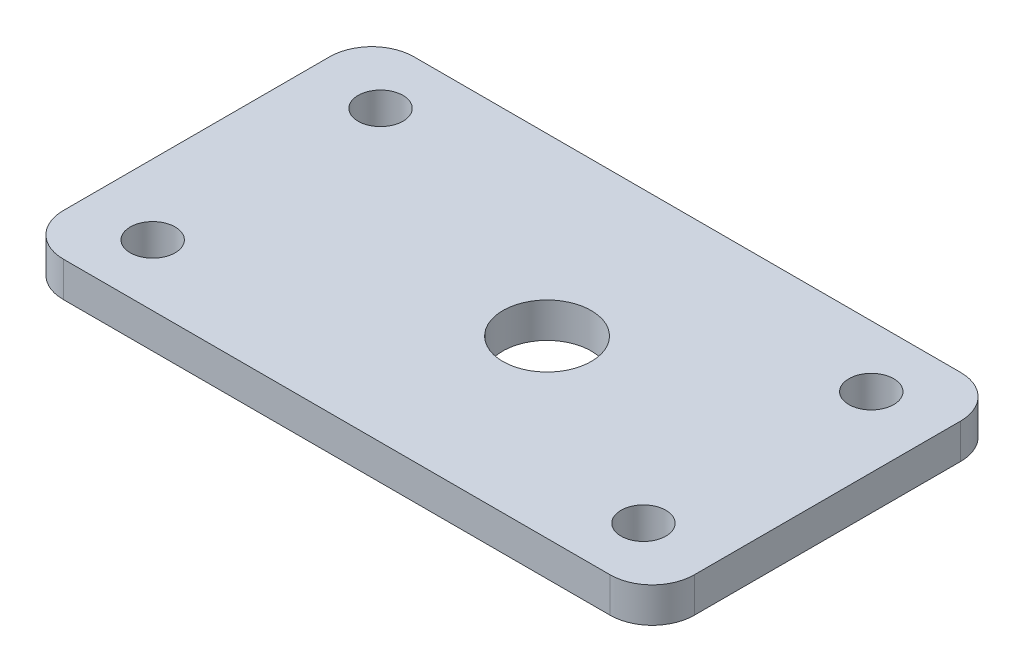
ISO-10303-21;
HEADER;
FILE_DESCRIPTION(('STEP AP214'),'2;1');
FILE_NAME('part.step','',(''),(''),'','','');
FILE_SCHEMA(('AUTOMOTIVE_DESIGN { 1 0 10303 214 1 1 1 1 }'));
ENDSEC;
DATA;
#1=APPLICATION_CONTEXT('core data for automotive mechanical design processes');
#2=APPLICATION_PROTOCOL_DEFINITION('international standard','automotive_design',2000,#1);
#3=PRODUCT_CONTEXT('',#1,'mechanical');
#4=PRODUCT('Part','Part','',(#3));
#5=PRODUCT_RELATED_PRODUCT_CATEGORY('part','',(#4));
#6=PRODUCT_DEFINITION_FORMATION('','',#4);
#7=PRODUCT_DEFINITION_CONTEXT('part definition',#1,'design');
#8=PRODUCT_DEFINITION('design','',#6,#7);
#9=PRODUCT_DEFINITION_SHAPE('','',#8);
#10=(LENGTH_UNIT() NAMED_UNIT(*) SI_UNIT(.MILLI.,.METRE.));
#11=(NAMED_UNIT(*) PLANE_ANGLE_UNIT() SI_UNIT($,.RADIAN.));
#12=(NAMED_UNIT(*) SI_UNIT($,.STERADIAN.) SOLID_ANGLE_UNIT());
#13=UNCERTAINTY_MEASURE_WITH_UNIT(LENGTH_MEASURE(1.E-05),#10,'distance_accuracy_value','');
#14=(GEOMETRIC_REPRESENTATION_CONTEXT(3) GLOBAL_UNCERTAINTY_ASSIGNED_CONTEXT((#13)) GLOBAL_UNIT_ASSIGNED_CONTEXT((#10,
#11,#12)) REPRESENTATION_CONTEXT('',''));
#15=CARTESIAN_POINT('',(0.,0.,0.));
#16=DIRECTION('',(0.,0.,1.));
#17=DIRECTION('',(1.,0.,0.));
#18=AXIS2_PLACEMENT_3D('',#15,#16,#17);
#19=CARTESIAN_POINT('',(0.,3.175,0.));
#20=DIRECTION('',(0.,1.,0.));
#21=DIRECTION('',(0.,0.,1.));
#22=AXIS2_PLACEMENT_3D('',#19,#20,#21);
#23=PLANE('',#22);
#24=CARTESIAN_POINT('',(22.2250000000296,3.175,10.3187500000224));
#25=DIRECTION('',(0.,-1.,0.));
#26=DIRECTION('',(0.,0.,-1.));
#27=AXIS2_PLACEMENT_3D('',#24,#25,#26);
#28=CIRCLE('',#27,2.03199999996506);
#29=CARTESIAN_POINT('',(22.2250000000296,3.175,8.28675000005738));
#30=VERTEX_POINT('',#29);
#31=EDGE_CURVE('E220',#30,#30,#28,.T.);
#32=ORIENTED_EDGE('',*,*,#31,.T.);
#33=EDGE_LOOP('',(#32));
#34=FACE_BOUND('',#33,.T.);
#35=CARTESIAN_POINT('',(-22.2249999999706,3.175,-10.3187499999772));
#36=DIRECTION('',(0.,-1.,0.));
#37=DIRECTION('',(0.,0.,-1.));
#38=AXIS2_PLACEMENT_3D('',#35,#36,#37);
#39=CIRCLE('',#38,2.03199999996518);
#40=CARTESIAN_POINT('',(-22.2249999999706,3.175,-12.3507499999424));
#41=VERTEX_POINT('',#40);
#42=EDGE_CURVE('E208',#41,#41,#39,.T.);
#43=ORIENTED_EDGE('',*,*,#42,.T.);
#44=EDGE_LOOP('',(#43));
#45=FACE_BOUND('',#44,.T.);
#46=CARTESIAN_POINT('',(-22.2249999999704,3.175,10.3187500000228));
#47=DIRECTION('',(0.,-1.,0.));
#48=DIRECTION('',(0.,0.,-1.));
#49=AXIS2_PLACEMENT_3D('',#46,#47,#48);
#50=CIRCLE('',#49,2.03199999996497);
#51=CARTESIAN_POINT('',(-22.2249999999704,3.175,8.28675000005783));
#52=VERTEX_POINT('',#51);
#53=EDGE_CURVE('E225',#52,#52,#50,.T.);
#54=ORIENTED_EDGE('',*,*,#53,.T.);
#55=EDGE_LOOP('',(#54));
#56=FACE_BOUND('',#55,.T.);
#57=CARTESIAN_POINT('',(22.2250000000294,3.175,-10.3187499999775));
#58=DIRECTION('',(0.,-1.,0.));
#59=DIRECTION('',(0.,0.,-1.));
#60=AXIS2_PLACEMENT_3D('',#57,#58,#59);
#61=CIRCLE('',#60,2.03199999996526);
#62=CARTESIAN_POINT('',(22.2250000000294,3.175,-12.3507499999428));
#63=VERTEX_POINT('',#62);
#64=EDGE_CURVE('E202',#63,#63,#61,.T.);
#65=ORIENTED_EDGE('',*,*,#64,.T.);
#66=EDGE_LOOP('',(#65));
#67=FACE_BOUND('',#66,.T.);
#68=DIRECTION('',(0.,0.,-1.));
#69=VECTOR('',#68,1.);
#70=CARTESIAN_POINT('',(28.575,3.175,15.875));
#71=LINE('',#70,#69);
#72=CARTESIAN_POINT('',(28.575,3.175,12.065));
#73=VERTEX_POINT('',#72);
#74=CARTESIAN_POINT('',(28.575,3.175,-12.065));
#75=VERTEX_POINT('',#74);
#76=EDGE_CURVE('E158',#73,#75,#71,.T.);
#77=ORIENTED_EDGE('',*,*,#76,.T.);
#78=CARTESIAN_POINT('',(24.765,3.175,-12.065));
#79=DIRECTION('',(0.,1.,0.));
#80=DIRECTION('',(0.,0.,1.));
#81=AXIS2_PLACEMENT_3D('',#78,#79,#80);
#82=CIRCLE('',#81,3.81);
#83=CARTESIAN_POINT('',(24.765,3.175,-15.875));
#84=VERTEX_POINT('',#83);
#85=EDGE_CURVE('E173',#75,#84,#82,.T.);
#86=ORIENTED_EDGE('',*,*,#85,.T.);
#87=DIRECTION('',(-1.,0.,0.));
#88=VECTOR('',#87,1.);
#89=CARTESIAN_POINT('',(28.575,3.175,-15.875));
#90=LINE('',#89,#88);
#91=CARTESIAN_POINT('',(-24.765,3.175,-15.875));
#92=VERTEX_POINT('',#91);
#93=EDGE_CURVE('E136',#84,#92,#90,.T.);
#94=ORIENTED_EDGE('',*,*,#93,.T.);
#95=CARTESIAN_POINT('',(-24.765,3.175,-12.065));
#96=DIRECTION('',(0.,1.,0.));
#97=DIRECTION('',(0.,0.,1.));
#98=AXIS2_PLACEMENT_3D('',#95,#96,#97);
#99=CIRCLE('',#98,3.81);
#100=CARTESIAN_POINT('',(-28.575,3.175,-12.065));
#101=VERTEX_POINT('',#100);
#102=EDGE_CURVE('E166',#92,#101,#99,.T.);
#103=ORIENTED_EDGE('',*,*,#102,.T.);
#104=DIRECTION('',(0.,0.,-1.));
#105=VECTOR('',#104,1.);
#106=CARTESIAN_POINT('',(-28.575,3.175,15.875));
#107=LINE('',#106,#105);
#108=CARTESIAN_POINT('',(-28.575,3.175,12.065));
#109=VERTEX_POINT('',#108);
#110=EDGE_CURVE('E184',#109,#101,#107,.T.);
#111=ORIENTED_EDGE('',*,*,#110,.F.);
#112=CARTESIAN_POINT('',(-24.765,3.175,12.065));
#113=DIRECTION('',(0.,1.,0.));
#114=DIRECTION('',(0.,0.,1.));
#115=AXIS2_PLACEMENT_3D('',#112,#113,#114);
#116=CIRCLE('',#115,3.81);
#117=CARTESIAN_POINT('',(-24.765,3.175,15.875));
#118=VERTEX_POINT('',#117);
#119=EDGE_CURVE('E69',#109,#118,#116,.T.);
#120=ORIENTED_EDGE('',*,*,#119,.T.);
#121=DIRECTION('',(-1.,0.,0.));
#122=VECTOR('',#121,1.);
#123=CARTESIAN_POINT('',(28.575,3.175,15.875));
#124=LINE('',#123,#122);
#125=CARTESIAN_POINT('',(24.765,3.175,15.875));
#126=VERTEX_POINT('',#125);
#127=EDGE_CURVE('E159',#126,#118,#124,.T.);
#128=ORIENTED_EDGE('',*,*,#127,.F.);
#129=CARTESIAN_POINT('',(24.765,3.175,12.065));
#130=DIRECTION('',(0.,1.,0.));
#131=DIRECTION('',(0.,0.,1.));
#132=AXIS2_PLACEMENT_3D('',#129,#130,#131);
#133=CIRCLE('',#132,3.81);
#134=EDGE_CURVE('E171',#126,#73,#133,.T.);
#135=ORIENTED_EDGE('',*,*,#134,.T.);
#136=EDGE_LOOP('',(#77,#86,#94,#103,#111,#120,#128,#135));
#137=FACE_BOUND('',#136,.T.);
#138=CARTESIAN_POINT('',(3.175,3.175,0.));
#139=DIRECTION('',(0.,1.,0.));
#140=DIRECTION('',(0.,0.,1.));
#141=AXIS2_PLACEMENT_3D('',#138,#139,#140);
#142=CIRCLE('',#141,4.);
#143=CARTESIAN_POINT('',(3.175,3.175,4.));
#144=VERTEX_POINT('',#143);
#145=EDGE_CURVE('E155',#144,#144,#142,.T.);
#146=ORIENTED_EDGE('',*,*,#145,.F.);
#147=EDGE_LOOP('',(#146));
#148=FACE_BOUND('',#147,.T.);
#149=ADVANCED_FACE('F53',(#34,#45,#56,#67,#137,#148),#23,.T.);
#150=CARTESIAN_POINT('',(0.,0.,0.));
#151=DIRECTION('',(0.,1.,0.));
#152=DIRECTION('',(0.,0.,1.));
#153=AXIS2_PLACEMENT_3D('',#150,#151,#152);
#154=PLANE('',#153);
#155=CARTESIAN_POINT('',(22.2250000000296,0.,10.3187500000224));
#156=DIRECTION('',(0.,-1.,0.));
#157=DIRECTION('',(0.,0.,-1.));
#158=AXIS2_PLACEMENT_3D('',#155,#156,#157);
#159=CIRCLE('',#158,2.03199999996506);
#160=CARTESIAN_POINT('',(22.2250000000296,0.,8.28675000005738));
#161=VERTEX_POINT('',#160);
#162=EDGE_CURVE('E210',#161,#161,#159,.T.);
#163=ORIENTED_EDGE('',*,*,#162,.F.);
#164=EDGE_LOOP('',(#163));
#165=FACE_BOUND('',#164,.T.);
#166=CARTESIAN_POINT('',(-22.2249999999706,0.,-10.3187499999772));
#167=DIRECTION('',(0.,-1.,0.));
#168=DIRECTION('',(0.,0.,-1.));
#169=AXIS2_PLACEMENT_3D('',#166,#167,#168);
#170=CIRCLE('',#169,2.03199999996518);
#171=CARTESIAN_POINT('',(-22.2249999999706,0.,-12.3507499999424));
#172=VERTEX_POINT('',#171);
#173=EDGE_CURVE('E214',#172,#172,#170,.T.);
#174=ORIENTED_EDGE('',*,*,#173,.F.);
#175=EDGE_LOOP('',(#174));
#176=FACE_BOUND('',#175,.T.);
#177=CARTESIAN_POINT('',(-22.2249999999704,0.,10.3187500000228));
#178=DIRECTION('',(0.,-1.,0.));
#179=DIRECTION('',(0.,0.,-1.));
#180=AXIS2_PLACEMENT_3D('',#177,#178,#179);
#181=CIRCLE('',#180,2.03199999996497);
#182=CARTESIAN_POINT('',(-22.2249999999704,0.,8.28675000005783));
#183=VERTEX_POINT('',#182);
#184=EDGE_CURVE('E211',#183,#183,#181,.T.);
#185=ORIENTED_EDGE('',*,*,#184,.F.);
#186=EDGE_LOOP('',(#185));
#187=FACE_BOUND('',#186,.T.);
#188=CARTESIAN_POINT('',(22.2250000000294,0.,-10.3187499999775));
#189=DIRECTION('',(0.,-1.,0.));
#190=DIRECTION('',(0.,0.,-1.));
#191=AXIS2_PLACEMENT_3D('',#188,#189,#190);
#192=CIRCLE('',#191,2.03199999996526);
#193=CARTESIAN_POINT('',(22.2250000000294,0.,-12.3507499999428));
#194=VERTEX_POINT('',#193);
#195=EDGE_CURVE('E204',#194,#194,#192,.T.);
#196=ORIENTED_EDGE('',*,*,#195,.F.);
#197=EDGE_LOOP('',(#196));
#198=FACE_BOUND('',#197,.T.);
#199=DIRECTION('',(-1.,0.,0.));
#200=VECTOR('',#199,1.);
#201=CARTESIAN_POINT('',(28.575,0.,-15.875));
#202=LINE('',#201,#200);
#203=CARTESIAN_POINT('',(24.765,0.,-15.875));
#204=VERTEX_POINT('',#203);
#205=CARTESIAN_POINT('',(-24.765,0.,-15.875));
#206=VERTEX_POINT('',#205);
#207=EDGE_CURVE('E140',#204,#206,#202,.T.);
#208=ORIENTED_EDGE('',*,*,#207,.F.);
#209=CARTESIAN_POINT('',(24.765,0.,-12.065));
#210=DIRECTION('',(0.,1.,0.));
#211=DIRECTION('',(0.,0.,1.));
#212=AXIS2_PLACEMENT_3D('',#209,#210,#211);
#213=CIRCLE('',#212,3.81);
#214=CARTESIAN_POINT('',(28.575,0.,-12.065));
#215=VERTEX_POINT('',#214);
#216=EDGE_CURVE('E119',#204,#215,#213,.F.);
#217=ORIENTED_EDGE('',*,*,#216,.T.);
#218=DIRECTION('',(0.,0.,-1.));
#219=VECTOR('',#218,1.);
#220=CARTESIAN_POINT('',(28.575,0.,15.875));
#221=LINE('',#220,#219);
#222=CARTESIAN_POINT('',(28.575,0.,12.065));
#223=VERTEX_POINT('',#222);
#224=EDGE_CURVE('E149',#223,#215,#221,.T.);
#225=ORIENTED_EDGE('',*,*,#224,.F.);
#226=CARTESIAN_POINT('',(24.765,0.,12.065));
#227=DIRECTION('',(0.,1.,0.));
#228=DIRECTION('',(0.,0.,1.));
#229=AXIS2_PLACEMENT_3D('',#226,#227,#228);
#230=CIRCLE('',#229,3.81);
#231=CARTESIAN_POINT('',(24.765,0.,15.875));
#232=VERTEX_POINT('',#231);
#233=EDGE_CURVE('E132',#223,#232,#230,.F.);
#234=ORIENTED_EDGE('',*,*,#233,.T.);
#235=DIRECTION('',(-1.,0.,0.));
#236=VECTOR('',#235,1.);
#237=CARTESIAN_POINT('',(28.575,0.,15.875));
#238=LINE('',#237,#236);
#239=CARTESIAN_POINT('',(-24.765,0.,15.875));
#240=VERTEX_POINT('',#239);
#241=EDGE_CURVE('E148',#232,#240,#238,.T.);
#242=ORIENTED_EDGE('',*,*,#241,.T.);
#243=CARTESIAN_POINT('',(-24.765,0.,12.065));
#244=DIRECTION('',(0.,1.,0.));
#245=DIRECTION('',(0.,0.,1.));
#246=AXIS2_PLACEMENT_3D('',#243,#244,#245);
#247=CIRCLE('',#246,3.81);
#248=CARTESIAN_POINT('',(-28.575,0.,12.065));
#249=VERTEX_POINT('',#248);
#250=EDGE_CURVE('E162',#240,#249,#247,.F.);
#251=ORIENTED_EDGE('',*,*,#250,.T.);
#252=DIRECTION('',(0.,0.,-1.));
#253=VECTOR('',#252,1.);
#254=CARTESIAN_POINT('',(-28.575,0.,15.875));
#255=LINE('',#254,#253);
#256=CARTESIAN_POINT('',(-28.575,0.,-12.065));
#257=VERTEX_POINT('',#256);
#258=EDGE_CURVE('E150',#249,#257,#255,.T.);
#259=ORIENTED_EDGE('',*,*,#258,.T.);
#260=CARTESIAN_POINT('',(-24.765,0.,-12.065));
#261=DIRECTION('',(0.,1.,0.));
#262=DIRECTION('',(0.,0.,1.));
#263=AXIS2_PLACEMENT_3D('',#260,#261,#262);
#264=CIRCLE('',#263,3.81);
#265=EDGE_CURVE('E142',#257,#206,#264,.F.);
#266=ORIENTED_EDGE('',*,*,#265,.T.);
#267=EDGE_LOOP('',(#208,#217,#225,#234,#242,#251,#259,#266));
#268=FACE_BOUND('',#267,.T.);
#269=CARTESIAN_POINT('',(3.175,0.,0.));
#270=DIRECTION('',(0.,1.,0.));
#271=DIRECTION('',(0.,0.,1.));
#272=AXIS2_PLACEMENT_3D('',#269,#270,#271);
#273=CIRCLE('',#272,4.);
#274=CARTESIAN_POINT('',(3.175,0.,4.));
#275=VERTEX_POINT('',#274);
#276=EDGE_CURVE('E198',#275,#275,#273,.T.);
#277=ORIENTED_EDGE('',*,*,#276,.T.);
#278=EDGE_LOOP('',(#277));
#279=FACE_BOUND('',#278,.T.);
#280=ADVANCED_FACE('F144',(#165,#176,#187,#198,#268,#279),#154,.F.);
#281=CARTESIAN_POINT('',(28.575,3.175,15.875));
#282=DIRECTION('',(-1.,0.,0.));
#283=DIRECTION('',(0.,0.,1.));
#284=AXIS2_PLACEMENT_3D('',#281,#282,#283);
#285=PLANE('',#284);
#286=ORIENTED_EDGE('',*,*,#224,.T.);
#287=DIRECTION('',(0.,-1.,0.));
#288=VECTOR('',#287,1.);
#289=CARTESIAN_POINT('',(28.575,3.175,-12.065));
#290=LINE('',#289,#288);
#291=EDGE_CURVE('E123',#215,#75,#290,.F.);
#292=ORIENTED_EDGE('',*,*,#291,.T.);
#293=ORIENTED_EDGE('',*,*,#76,.F.);
#294=DIRECTION('',(0.,-1.,0.));
#295=VECTOR('',#294,1.);
#296=CARTESIAN_POINT('',(28.575,0.,12.065));
#297=LINE('',#296,#295);
#298=EDGE_CURVE('E128',#73,#223,#297,.T.);
#299=ORIENTED_EDGE('',*,*,#298,.T.);
#300=EDGE_LOOP('',(#286,#292,#293,#299));
#301=FACE_BOUND('',#300,.T.);
#302=ADVANCED_FACE('F235',(#301),#285,.F.);
#303=CARTESIAN_POINT('',(28.575,3.175,-15.875));
#304=DIRECTION('',(0.,0.,1.));
#305=DIRECTION('',(1.,0.,0.));
#306=AXIS2_PLACEMENT_3D('',#303,#304,#305);
#307=PLANE('',#306);
#308=ORIENTED_EDGE('',*,*,#93,.F.);
#309=DIRECTION('',(0.,-1.,0.));
#310=VECTOR('',#309,1.);
#311=CARTESIAN_POINT('',(24.765,3.175,-15.875));
#312=LINE('',#311,#310);
#313=EDGE_CURVE('E121',#84,#204,#312,.T.);
#314=ORIENTED_EDGE('',*,*,#313,.T.);
#315=ORIENTED_EDGE('',*,*,#207,.T.);
#316=DIRECTION('',(0.,-1.,0.));
#317=VECTOR('',#316,1.);
#318=CARTESIAN_POINT('',(-24.765,3.175,-15.875));
#319=LINE('',#318,#317);
#320=EDGE_CURVE('E145',#206,#92,#319,.F.);
#321=ORIENTED_EDGE('',*,*,#320,.T.);
#322=EDGE_LOOP('',(#308,#314,#315,#321));
#323=FACE_BOUND('',#322,.T.);
#324=ADVANCED_FACE('F137',(#323),#307,.F.);
#325=CARTESIAN_POINT('',(-28.575,3.175,15.875));
#326=DIRECTION('',(-1.,0.,0.));
#327=DIRECTION('',(0.,0.,1.));
#328=AXIS2_PLACEMENT_3D('',#325,#326,#327);
#329=PLANE('',#328);
#330=ORIENTED_EDGE('',*,*,#258,.F.);
#331=DIRECTION('',(0.,-1.,0.));
#332=VECTOR('',#331,1.);
#333=CARTESIAN_POINT('',(-28.575,3.175,12.065));
#334=LINE('',#333,#332);
#335=EDGE_CURVE('E12',#249,#109,#334,.F.);
#336=ORIENTED_EDGE('',*,*,#335,.T.);
#337=ORIENTED_EDGE('',*,*,#110,.T.);
#338=DIRECTION('',(0.,-1.,0.));
#339=VECTOR('',#338,1.);
#340=CARTESIAN_POINT('',(-28.575,0.,-12.065));
#341=LINE('',#340,#339);
#342=EDGE_CURVE('E65',#101,#257,#341,.T.);
#343=ORIENTED_EDGE('',*,*,#342,.T.);
#344=EDGE_LOOP('',(#330,#336,#337,#343));
#345=FACE_BOUND('',#344,.T.);
#346=ADVANCED_FACE('F182',(#345),#329,.T.);
#347=CARTESIAN_POINT('',(28.575,3.175,15.875));
#348=DIRECTION('',(0.,0.,1.));
#349=DIRECTION('',(1.,0.,0.));
#350=AXIS2_PLACEMENT_3D('',#347,#348,#349);
#351=PLANE('',#350);
#352=ORIENTED_EDGE('',*,*,#241,.F.);
#353=DIRECTION('',(0.,-1.,0.));
#354=VECTOR('',#353,1.);
#355=CARTESIAN_POINT('',(24.765,3.175,15.875));
#356=LINE('',#355,#354);
#357=EDGE_CURVE('E77',#232,#126,#356,.F.);
#358=ORIENTED_EDGE('',*,*,#357,.T.);
#359=ORIENTED_EDGE('',*,*,#127,.T.);
#360=DIRECTION('',(0.,-1.,0.));
#361=VECTOR('',#360,1.);
#362=CARTESIAN_POINT('',(-24.765,3.175,15.875));
#363=LINE('',#362,#361);
#364=EDGE_CURVE('E174',#118,#240,#363,.T.);
#365=ORIENTED_EDGE('',*,*,#364,.T.);
#366=EDGE_LOOP('',(#352,#358,#359,#365));
#367=FACE_BOUND('',#366,.T.);
#368=ADVANCED_FACE('F192',(#367),#351,.T.);
#369=CARTESIAN_POINT('',(3.175,3.175,0.));
#370=DIRECTION('',(0.,-1.,0.));
#371=DIRECTION('',(0.,0.,-1.));
#372=AXIS2_PLACEMENT_3D('',#369,#370,#371);
#373=CYLINDRICAL_SURFACE('',#372,4.);
#374=ORIENTED_EDGE('',*,*,#145,.T.);
#375=EDGE_LOOP('',(#374));
#376=FACE_BOUND('',#375,.T.);
#377=ORIENTED_EDGE('',*,*,#276,.F.);
#378=EDGE_LOOP('',(#377));
#379=FACE_BOUND('',#378,.T.);
#380=ADVANCED_FACE('F260',(#376,#379),#373,.F.);
#381=CARTESIAN_POINT('',(24.765,3.175,-12.065));
#382=DIRECTION('',(0.,-1.,0.));
#383=DIRECTION('',(0.,0.,-1.));
#384=AXIS2_PLACEMENT_3D('',#381,#382,#383);
#385=CYLINDRICAL_SURFACE('',#384,3.81);
#386=ORIENTED_EDGE('',*,*,#85,.F.);
#387=ORIENTED_EDGE('',*,*,#291,.F.);
#388=ORIENTED_EDGE('',*,*,#216,.F.);
#389=ORIENTED_EDGE('',*,*,#313,.F.);
#390=EDGE_LOOP('',(#386,#387,#388,#389));
#391=FACE_BOUND('',#390,.T.);
#392=ADVANCED_FACE('F124',(#391),#385,.T.);
#393=CARTESIAN_POINT('',(24.765,3.175,12.065));
#394=DIRECTION('',(0.,1.,0.));
#395=DIRECTION('',(0.,0.,1.));
#396=AXIS2_PLACEMENT_3D('',#393,#394,#395);
#397=CYLINDRICAL_SURFACE('',#396,3.81);
#398=ORIENTED_EDGE('',*,*,#134,.F.);
#399=ORIENTED_EDGE('',*,*,#357,.F.);
#400=ORIENTED_EDGE('',*,*,#233,.F.);
#401=ORIENTED_EDGE('',*,*,#298,.F.);
#402=EDGE_LOOP('',(#398,#399,#400,#401));
#403=FACE_BOUND('',#402,.T.);
#404=ADVANCED_FACE('F266',(#403),#397,.T.);
#405=CARTESIAN_POINT('',(-24.765,3.175,12.065));
#406=DIRECTION('',(0.,-1.,0.));
#407=DIRECTION('',(0.,0.,-1.));
#408=AXIS2_PLACEMENT_3D('',#405,#406,#407);
#409=CYLINDRICAL_SURFACE('',#408,3.81);
#410=ORIENTED_EDGE('',*,*,#119,.F.);
#411=ORIENTED_EDGE('',*,*,#335,.F.);
#412=ORIENTED_EDGE('',*,*,#250,.F.);
#413=ORIENTED_EDGE('',*,*,#364,.F.);
#414=EDGE_LOOP('',(#410,#411,#412,#413));
#415=FACE_BOUND('',#414,.T.);
#416=ADVANCED_FACE('F188',(#415),#409,.T.);
#417=CARTESIAN_POINT('',(-24.765,3.175,-12.065));
#418=DIRECTION('',(0.,1.,0.));
#419=DIRECTION('',(0.,0.,1.));
#420=AXIS2_PLACEMENT_3D('',#417,#418,#419);
#421=CYLINDRICAL_SURFACE('',#420,3.81);
#422=ORIENTED_EDGE('',*,*,#102,.F.);
#423=ORIENTED_EDGE('',*,*,#320,.F.);
#424=ORIENTED_EDGE('',*,*,#265,.F.);
#425=ORIENTED_EDGE('',*,*,#342,.F.);
#426=EDGE_LOOP('',(#422,#423,#424,#425));
#427=FACE_BOUND('',#426,.T.);
#428=ADVANCED_FACE('F57',(#427),#421,.T.);
#429=CARTESIAN_POINT('',(22.2250000000294,3.175,-10.3187499999775));
#430=DIRECTION('',(0.,-1.,0.));
#431=DIRECTION('',(0.,0.,-1.));
#432=AXIS2_PLACEMENT_3D('',#429,#430,#431);
#433=CYLINDRICAL_SURFACE('',#432,2.03199999996526);
#434=ORIENTED_EDGE('',*,*,#64,.F.);
#435=EDGE_LOOP('',(#434));
#436=FACE_BOUND('',#435,.T.);
#437=ORIENTED_EDGE('',*,*,#195,.T.);
#438=EDGE_LOOP('',(#437));
#439=FACE_BOUND('',#438,.T.);
#440=ADVANCED_FACE('F240',(#436,#439),#433,.F.);
#441=CARTESIAN_POINT('',(-22.2249999999704,3.175,10.3187500000228));
#442=DIRECTION('',(0.,-1.,0.));
#443=DIRECTION('',(0.,0.,-1.));
#444=AXIS2_PLACEMENT_3D('',#441,#442,#443);
#445=CYLINDRICAL_SURFACE('',#444,2.03199999996497);
#446=ORIENTED_EDGE('',*,*,#53,.F.);
#447=EDGE_LOOP('',(#446));
#448=FACE_BOUND('',#447,.T.);
#449=ORIENTED_EDGE('',*,*,#184,.T.);
#450=EDGE_LOOP('',(#449));
#451=FACE_BOUND('',#450,.T.);
#452=ADVANCED_FACE('F226',(#448,#451),#445,.F.);
#453=CARTESIAN_POINT('',(-22.2249999999706,3.175,-10.3187499999772));
#454=DIRECTION('',(0.,-1.,0.));
#455=DIRECTION('',(0.,0.,-1.));
#456=AXIS2_PLACEMENT_3D('',#453,#454,#455);
#457=CYLINDRICAL_SURFACE('',#456,2.03199999996518);
#458=ORIENTED_EDGE('',*,*,#42,.F.);
#459=EDGE_LOOP('',(#458));
#460=FACE_BOUND('',#459,.T.);
#461=ORIENTED_EDGE('',*,*,#173,.T.);
#462=EDGE_LOOP('',(#461));
#463=FACE_BOUND('',#462,.T.);
#464=ADVANCED_FACE('F242',(#460,#463),#457,.F.);
#465=CARTESIAN_POINT('',(22.2250000000296,3.175,10.3187500000224));
#466=DIRECTION('',(0.,-1.,0.));
#467=DIRECTION('',(0.,0.,-1.));
#468=AXIS2_PLACEMENT_3D('',#465,#466,#467);
#469=CYLINDRICAL_SURFACE('',#468,2.03199999996506);
#470=ORIENTED_EDGE('',*,*,#31,.F.);
#471=EDGE_LOOP('',(#470));
#472=FACE_BOUND('',#471,.T.);
#473=ORIENTED_EDGE('',*,*,#162,.T.);
#474=EDGE_LOOP('',(#473));
#475=FACE_BOUND('',#474,.T.);
#476=ADVANCED_FACE('F303',(#472,#475),#469,.F.);
#477=CLOSED_SHELL('',(#149,#280,#302,#324,#346,#368,#380,#392,#404,#416,#428,#440,#452,#464,#476));
#478=MANIFOLD_SOLID_BREP('B2',#477);
#479=ADVANCED_BREP_SHAPE_REPRESENTATION('',(#18,#478),#14);
#480=SHAPE_DEFINITION_REPRESENTATION(#9,#479);
ENDSEC;
END-ISO-10303-21;
